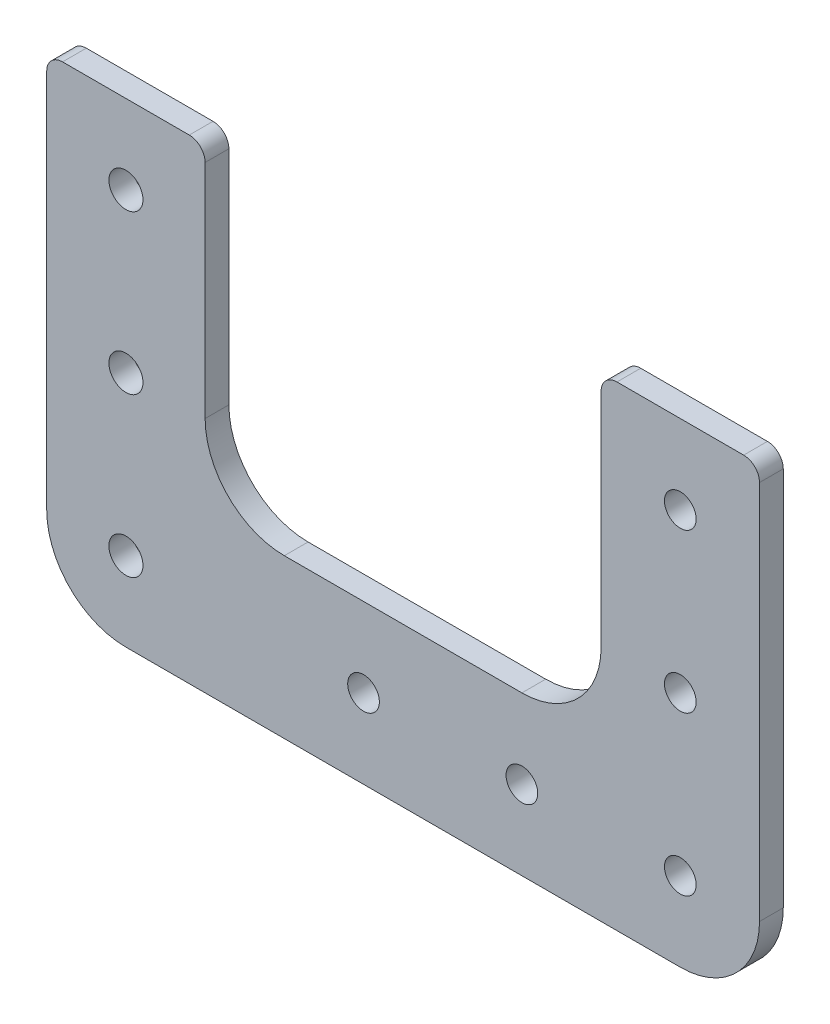
ISO-10303-21;
HEADER;
FILE_DESCRIPTION(('STEP AP214'),'2;1');
FILE_NAME('part.step','',(''),(''),'','','');
FILE_SCHEMA(('AUTOMOTIVE_DESIGN { 1 0 10303 214 1 1 1 1 }'));
ENDSEC;
DATA;
#1=APPLICATION_CONTEXT('core data for automotive mechanical design processes');
#2=APPLICATION_PROTOCOL_DEFINITION('international standard','automotive_design',2000,#1);
#3=PRODUCT_CONTEXT('',#1,'mechanical');
#4=PRODUCT('Part','Part','',(#3));
#5=PRODUCT_RELATED_PRODUCT_CATEGORY('part','',(#4));
#6=PRODUCT_DEFINITION_FORMATION('','',#4);
#7=PRODUCT_DEFINITION_CONTEXT('part definition',#1,'design');
#8=PRODUCT_DEFINITION('design','',#6,#7);
#9=PRODUCT_DEFINITION_SHAPE('','',#8);
#10=(LENGTH_UNIT() NAMED_UNIT(*) SI_UNIT(.MILLI.,.METRE.));
#11=(NAMED_UNIT(*) PLANE_ANGLE_UNIT() SI_UNIT($,.RADIAN.));
#12=(NAMED_UNIT(*) SI_UNIT($,.STERADIAN.) SOLID_ANGLE_UNIT());
#13=UNCERTAINTY_MEASURE_WITH_UNIT(LENGTH_MEASURE(1.E-05),#10,'distance_accuracy_value','');
#14=(GEOMETRIC_REPRESENTATION_CONTEXT(3) GLOBAL_UNCERTAINTY_ASSIGNED_CONTEXT((#13)) GLOBAL_UNIT_ASSIGNED_CONTEXT((#10,
#11,#12)) REPRESENTATION_CONTEXT('',''));
#15=CARTESIAN_POINT('',(0.,0.,0.));
#16=DIRECTION('',(0.,0.,1.));
#17=DIRECTION('',(1.,0.,0.));
#18=AXIS2_PLACEMENT_3D('',#15,#16,#17);
#19=CARTESIAN_POINT('',(0.,0.,3.));
#20=DIRECTION('',(1.,0.,0.));
#21=DIRECTION('',(0.,0.,-1.));
#22=AXIS2_PLACEMENT_3D('',#19,#20,#21);
#23=PLANE('',#22);
#24=DIRECTION('',(0.,-1.,0.));
#25=VECTOR('',#24,1.);
#26=CARTESIAN_POINT('',(0.,0.,3.));
#27=LINE('',#26,#25);
#28=CARTESIAN_POINT('',(0.,58.,3.));
#29=VERTEX_POINT('',#28);
#30=CARTESIAN_POINT('',(0.,30.,3.));
#31=VERTEX_POINT('',#30);
#32=EDGE_CURVE('E315',#29,#31,#27,.T.);
#33=ORIENTED_EDGE('',*,*,#32,.F.);
#34=DIRECTION('',(0.,0.,-1.));
#35=VECTOR('',#34,1.);
#36=CARTESIAN_POINT('',(0.,58.,3.));
#37=LINE('',#36,#35);
#38=CARTESIAN_POINT('',(0.,58.,0.));
#39=VERTEX_POINT('',#38);
#40=EDGE_CURVE('E243',#29,#39,#37,.T.);
#41=ORIENTED_EDGE('',*,*,#40,.T.);
#42=DIRECTION('',(0.,-1.,0.));
#43=VECTOR('',#42,1.);
#44=CARTESIAN_POINT('',(0.,0.,0.));
#45=LINE('',#44,#43);
#46=CARTESIAN_POINT('',(0.,30.,0.));
#47=VERTEX_POINT('',#46);
#48=EDGE_CURVE('E312',#39,#47,#45,.T.);
#49=ORIENTED_EDGE('',*,*,#48,.T.);
#50=DIRECTION('',(0.,0.,1.));
#51=VECTOR('',#50,1.);
#52=CARTESIAN_POINT('',(0.,30.,3.));
#53=LINE('',#52,#51);
#54=EDGE_CURVE('E168',#47,#31,#53,.T.);
#55=ORIENTED_EDGE('',*,*,#54,.T.);
#56=EDGE_LOOP('',(#33,#41,#49,#55));
#57=FACE_BOUND('',#56,.T.);
#58=ADVANCED_FACE('F43',(#57),#23,.F.);
#59=CARTESIAN_POINT('',(0.,0.,3.));
#60=DIRECTION('',(0.,1.,0.));
#61=DIRECTION('',(0.,0.,1.));
#62=AXIS2_PLACEMENT_3D('',#59,#60,#61);
#63=PLANE('',#62);
#64=DIRECTION('',(1.,0.,0.));
#65=VECTOR('',#64,1.);
#66=CARTESIAN_POINT('',(0.,0.,3.));
#67=LINE('',#66,#65);
#68=CARTESIAN_POINT('',(-60.,0.,3.));
#69=VERTEX_POINT('',#68);
#70=CARTESIAN_POINT('',(10.,0.,3.));
#71=VERTEX_POINT('',#70);
#72=EDGE_CURVE('E163',#69,#71,#67,.T.);
#73=ORIENTED_EDGE('',*,*,#72,.F.);
#74=DIRECTION('',(0.,0.,1.));
#75=VECTOR('',#74,1.);
#76=CARTESIAN_POINT('',(-60.,0.,0.));
#77=LINE('',#76,#75);
#78=CARTESIAN_POINT('',(-60.,0.,0.));
#79=VERTEX_POINT('',#78);
#80=EDGE_CURVE('E207',#69,#79,#77,.F.);
#81=ORIENTED_EDGE('',*,*,#80,.T.);
#82=DIRECTION('',(1.,0.,0.));
#83=VECTOR('',#82,1.);
#84=CARTESIAN_POINT('',(0.,0.,0.));
#85=LINE('',#84,#83);
#86=CARTESIAN_POINT('',(10.,0.,0.));
#87=VERTEX_POINT('',#86);
#88=EDGE_CURVE('E319',#79,#87,#85,.T.);
#89=ORIENTED_EDGE('',*,*,#88,.T.);
#90=DIRECTION('',(0.,0.,-1.));
#91=VECTOR('',#90,1.);
#92=CARTESIAN_POINT('',(10.,0.,3.));
#93=LINE('',#92,#91);
#94=EDGE_CURVE('E169',#87,#71,#93,.F.);
#95=ORIENTED_EDGE('',*,*,#94,.T.);
#96=EDGE_LOOP('',(#73,#81,#89,#95));
#97=FACE_BOUND('',#96,.T.);
#98=ADVANCED_FACE('F419',(#97),#63,.F.);
#99=CARTESIAN_POINT('',(20.,0.,3.));
#100=DIRECTION('',(-1.,0.,0.));
#101=DIRECTION('',(0.,-1.,0.));
#102=AXIS2_PLACEMENT_3D('',#99,#100,#101);
#103=PLANE('',#102);
#104=DIRECTION('',(0.,1.,0.));
#105=VECTOR('',#104,1.);
#106=CARTESIAN_POINT('',(20.,0.,0.));
#107=LINE('',#106,#105);
#108=CARTESIAN_POINT('',(20.,10.,0.));
#109=VERTEX_POINT('',#108);
#110=CARTESIAN_POINT('',(20.,58.,0.));
#111=VERTEX_POINT('',#110);
#112=EDGE_CURVE('E320',#109,#111,#107,.T.);
#113=ORIENTED_EDGE('',*,*,#112,.T.);
#114=DIRECTION('',(0.,0.,-1.));
#115=VECTOR('',#114,1.);
#116=CARTESIAN_POINT('',(20.,58.,3.));
#117=LINE('',#116,#115);
#118=CARTESIAN_POINT('',(20.,58.,3.));
#119=VERTEX_POINT('',#118);
#120=EDGE_CURVE('E178',#111,#119,#117,.F.);
#121=ORIENTED_EDGE('',*,*,#120,.T.);
#122=DIRECTION('',(0.,1.,0.));
#123=VECTOR('',#122,1.);
#124=CARTESIAN_POINT('',(20.,0.,3.));
#125=LINE('',#124,#123);
#126=CARTESIAN_POINT('',(20.,10.,3.));
#127=VERTEX_POINT('',#126);
#128=EDGE_CURVE('E160',#127,#119,#125,.T.);
#129=ORIENTED_EDGE('',*,*,#128,.F.);
#130=DIRECTION('',(0.,0.,-1.));
#131=VECTOR('',#130,1.);
#132=CARTESIAN_POINT('',(20.,10.,3.));
#133=LINE('',#132,#131);
#134=EDGE_CURVE('E175',#127,#109,#133,.T.);
#135=ORIENTED_EDGE('',*,*,#134,.T.);
#136=EDGE_LOOP('',(#113,#121,#129,#135));
#137=FACE_BOUND('',#136,.T.);
#138=ADVANCED_FACE('F174',(#137),#103,.F.);
#139=CARTESIAN_POINT('',(0.,60.,3.));
#140=DIRECTION('',(0.,-1.,0.));
#141=DIRECTION('',(0.,0.,-1.));
#142=AXIS2_PLACEMENT_3D('',#139,#140,#141);
#143=PLANE('',#142);
#144=DIRECTION('',(-1.,0.,0.));
#145=VECTOR('',#144,1.);
#146=CARTESIAN_POINT('',(0.,60.,3.));
#147=LINE('',#146,#145);
#148=CARTESIAN_POINT('',(18.,60.,3.));
#149=VERTEX_POINT('',#148);
#150=CARTESIAN_POINT('',(2.,60.,3.));
#151=VERTEX_POINT('',#150);
#152=EDGE_CURVE('E179',#149,#151,#147,.T.);
#153=ORIENTED_EDGE('',*,*,#152,.F.);
#154=DIRECTION('',(0.,0.,-1.));
#155=VECTOR('',#154,1.);
#156=CARTESIAN_POINT('',(18.,60.,3.));
#157=LINE('',#156,#155);
#158=CARTESIAN_POINT('',(18.,60.,0.));
#159=VERTEX_POINT('',#158);
#160=EDGE_CURVE('E225',#149,#159,#157,.T.);
#161=ORIENTED_EDGE('',*,*,#160,.T.);
#162=DIRECTION('',(-1.,0.,0.));
#163=VECTOR('',#162,1.);
#164=CARTESIAN_POINT('',(0.,60.,0.));
#165=LINE('',#164,#163);
#166=CARTESIAN_POINT('',(2.,60.,0.));
#167=VERTEX_POINT('',#166);
#168=EDGE_CURVE('E189',#159,#167,#165,.T.);
#169=ORIENTED_EDGE('',*,*,#168,.T.);
#170=DIRECTION('',(0.,0.,-1.));
#171=VECTOR('',#170,1.);
#172=CARTESIAN_POINT('',(2.,60.,3.));
#173=LINE('',#172,#171);
#174=EDGE_CURVE('E223',#167,#151,#173,.F.);
#175=ORIENTED_EDGE('',*,*,#174,.T.);
#176=EDGE_LOOP('',(#153,#161,#169,#175));
#177=FACE_BOUND('',#176,.T.);
#178=ADVANCED_FACE('F325',(#177),#143,.F.);
#179=CARTESIAN_POINT('',(0.,0.,3.));
#180=DIRECTION('',(0.,0.,-1.));
#181=DIRECTION('',(-1.,0.,0.));
#182=AXIS2_PLACEMENT_3D('',#179,#180,#181);
#183=PLANE('',#182);
#184=CARTESIAN_POINT('',(-60.,10.,3.));
#185=DIRECTION('',(0.,0.,1.));
#186=DIRECTION('',(1.,0.,0.));
#187=AXIS2_PLACEMENT_3D('',#184,#185,#186);
#188=CIRCLE('',#187,2.15);
#189=CARTESIAN_POINT('',(-57.85,10.,3.));
#190=VERTEX_POINT('',#189);
#191=EDGE_CURVE('E370',#190,#190,#188,.T.);
#192=ORIENTED_EDGE('',*,*,#191,.F.);
#193=EDGE_LOOP('',(#192));
#194=FACE_BOUND('',#193,.T.);
#195=CARTESIAN_POINT('',(-60.,30.,3.));
#196=DIRECTION('',(0.,0.,1.));
#197=DIRECTION('',(1.,0.,0.));
#198=AXIS2_PLACEMENT_3D('',#195,#196,#197);
#199=CIRCLE('',#198,2.15);
#200=CARTESIAN_POINT('',(-57.85,30.,3.));
#201=VERTEX_POINT('',#200);
#202=EDGE_CURVE('E367',#201,#201,#199,.T.);
#203=ORIENTED_EDGE('',*,*,#202,.F.);
#204=EDGE_LOOP('',(#203));
#205=FACE_BOUND('',#204,.T.);
#206=CARTESIAN_POINT('',(-60.,50.,3.));
#207=DIRECTION('',(0.,0.,1.));
#208=DIRECTION('',(1.,0.,0.));
#209=AXIS2_PLACEMENT_3D('',#206,#207,#208);
#210=CIRCLE('',#209,2.15);
#211=CARTESIAN_POINT('',(-57.85,50.,3.));
#212=VERTEX_POINT('',#211);
#213=EDGE_CURVE('E361',#212,#212,#210,.T.);
#214=ORIENTED_EDGE('',*,*,#213,.F.);
#215=EDGE_LOOP('',(#214));
#216=FACE_BOUND('',#215,.T.);
#217=CARTESIAN_POINT('',(-30.,10.,3.));
#218=DIRECTION('',(0.,0.,1.));
#219=DIRECTION('',(-1.,0.,0.));
#220=AXIS2_PLACEMENT_3D('',#217,#218,#219);
#221=CIRCLE('',#220,2.);
#222=CARTESIAN_POINT('',(-32.,10.,3.));
#223=VERTEX_POINT('',#222);
#224=EDGE_CURVE('E298',#223,#223,#221,.T.);
#225=ORIENTED_EDGE('',*,*,#224,.F.);
#226=EDGE_LOOP('',(#225));
#227=FACE_BOUND('',#226,.T.);
#228=CARTESIAN_POINT('',(-9.99999999999999,10.,3.));
#229=DIRECTION('',(0.,0.,1.));
#230=DIRECTION('',(-1.,0.,0.));
#231=AXIS2_PLACEMENT_3D('',#228,#229,#230);
#232=CIRCLE('',#231,2.);
#233=CARTESIAN_POINT('',(-12.,10.,3.));
#234=VERTEX_POINT('',#233);
#235=EDGE_CURVE('E292',#234,#234,#232,.T.);
#236=ORIENTED_EDGE('',*,*,#235,.F.);
#237=EDGE_LOOP('',(#236));
#238=FACE_BOUND('',#237,.T.);
#239=CARTESIAN_POINT('',(9.99999999999999,50.,3.));
#240=DIRECTION('',(0.,0.,1.));
#241=DIRECTION('',(1.,0.,0.));
#242=AXIS2_PLACEMENT_3D('',#239,#240,#241);
#243=CIRCLE('',#242,2.);
#244=CARTESIAN_POINT('',(12.,50.,3.));
#245=VERTEX_POINT('',#244);
#246=EDGE_CURVE('E286',#245,#245,#243,.T.);
#247=ORIENTED_EDGE('',*,*,#246,.F.);
#248=EDGE_LOOP('',(#247));
#249=FACE_BOUND('',#248,.T.);
#250=CARTESIAN_POINT('',(10.,30.,3.));
#251=DIRECTION('',(0.,0.,1.));
#252=DIRECTION('',(1.,0.,0.));
#253=AXIS2_PLACEMENT_3D('',#250,#251,#252);
#254=CIRCLE('',#253,2.);
#255=CARTESIAN_POINT('',(12.,30.,3.));
#256=VERTEX_POINT('',#255);
#257=EDGE_CURVE('E279',#256,#256,#254,.T.);
#258=ORIENTED_EDGE('',*,*,#257,.F.);
#259=EDGE_LOOP('',(#258));
#260=FACE_BOUND('',#259,.T.);
#261=CARTESIAN_POINT('',(10.,10.,3.));
#262=DIRECTION('',(0.,0.,1.));
#263=DIRECTION('',(1.,0.,0.));
#264=AXIS2_PLACEMENT_3D('',#261,#262,#263);
#265=CIRCLE('',#264,2.);
#266=CARTESIAN_POINT('',(12.,10.,3.));
#267=VERTEX_POINT('',#266);
#268=EDGE_CURVE('E282',#267,#267,#265,.T.);
#269=ORIENTED_EDGE('',*,*,#268,.F.);
#270=EDGE_LOOP('',(#269));
#271=FACE_BOUND('',#270,.T.);
#272=ORIENTED_EDGE('',*,*,#128,.T.);
#273=CARTESIAN_POINT('',(18.,58.,3.));
#274=DIRECTION('',(0.,0.,-1.));
#275=DIRECTION('',(-1.,0.,0.));
#276=AXIS2_PLACEMENT_3D('',#273,#274,#275);
#277=CIRCLE('',#276,2.);
#278=EDGE_CURVE('E241',#119,#149,#277,.F.);
#279=ORIENTED_EDGE('',*,*,#278,.T.);
#280=ORIENTED_EDGE('',*,*,#152,.T.);
#281=CARTESIAN_POINT('',(2.,58.,3.));
#282=DIRECTION('',(0.,0.,-1.));
#283=DIRECTION('',(-1.,0.,0.));
#284=AXIS2_PLACEMENT_3D('',#281,#282,#283);
#285=CIRCLE('',#284,2.);
#286=EDGE_CURVE('E239',#151,#29,#285,.F.);
#287=ORIENTED_EDGE('',*,*,#286,.T.);
#288=ORIENTED_EDGE('',*,*,#32,.T.);
#289=CARTESIAN_POINT('',(-10.,30.,3.));
#290=DIRECTION('',(0.,0.,-1.));
#291=DIRECTION('',(-1.,0.,0.));
#292=AXIS2_PLACEMENT_3D('',#289,#290,#291);
#293=CIRCLE('',#292,10.);
#294=CARTESIAN_POINT('',(-10.,20.,3.));
#295=VERTEX_POINT('',#294);
#296=EDGE_CURVE('E197',#31,#295,#293,.T.);
#297=ORIENTED_EDGE('',*,*,#296,.T.);
#298=DIRECTION('',(-1.,0.,0.));
#299=VECTOR('',#298,1.);
#300=CARTESIAN_POINT('',(20.,20.,3.));
#301=LINE('',#300,#299);
#302=CARTESIAN_POINT('',(-40.,20.,3.));
#303=VERTEX_POINT('',#302);
#304=EDGE_CURVE('E306',#295,#303,#301,.T.);
#305=ORIENTED_EDGE('',*,*,#304,.T.);
#306=CARTESIAN_POINT('',(-40.,30.,3.));
#307=DIRECTION('',(0.,0.,-1.));
#308=DIRECTION('',(-1.,0.,0.));
#309=AXIS2_PLACEMENT_3D('',#306,#307,#308);
#310=CIRCLE('',#309,10.);
#311=CARTESIAN_POINT('',(-50.,30.,3.));
#312=VERTEX_POINT('',#311);
#313=EDGE_CURVE('E218',#303,#312,#310,.T.);
#314=ORIENTED_EDGE('',*,*,#313,.T.);
#315=DIRECTION('',(0.,-1.,0.));
#316=VECTOR('',#315,1.);
#317=CARTESIAN_POINT('',(-50.,0.,3.));
#318=LINE('',#317,#316);
#319=CARTESIAN_POINT('',(-50.,58.,3.));
#320=VERTEX_POINT('',#319);
#321=EDGE_CURVE('E272',#320,#312,#318,.T.);
#322=ORIENTED_EDGE('',*,*,#321,.F.);
#323=CARTESIAN_POINT('',(-52.,58.,3.));
#324=DIRECTION('',(0.,0.,-1.));
#325=DIRECTION('',(-1.,0.,0.));
#326=AXIS2_PLACEMENT_3D('',#323,#324,#325);
#327=CIRCLE('',#326,2.);
#328=CARTESIAN_POINT('',(-52.,60.,3.));
#329=VERTEX_POINT('',#328);
#330=EDGE_CURVE('E58',#320,#329,#327,.F.);
#331=ORIENTED_EDGE('',*,*,#330,.T.);
#332=DIRECTION('',(1.,0.,0.));
#333=VECTOR('',#332,1.);
#334=CARTESIAN_POINT('',(0.,60.,3.));
#335=LINE('',#334,#333);
#336=CARTESIAN_POINT('',(-68.,60.,3.));
#337=VERTEX_POINT('',#336);
#338=EDGE_CURVE('E270',#337,#329,#335,.T.);
#339=ORIENTED_EDGE('',*,*,#338,.F.);
#340=CARTESIAN_POINT('',(-68.,58.,3.));
#341=DIRECTION('',(0.,0.,-1.));
#342=DIRECTION('',(-1.,0.,0.));
#343=AXIS2_PLACEMENT_3D('',#340,#341,#342);
#344=CIRCLE('',#343,2.);
#345=CARTESIAN_POINT('',(-70.,58.,3.));
#346=VERTEX_POINT('',#345);
#347=EDGE_CURVE('E66',#337,#346,#344,.F.);
#348=ORIENTED_EDGE('',*,*,#347,.T.);
#349=DIRECTION('',(0.,-1.,0.));
#350=VECTOR('',#349,1.);
#351=CARTESIAN_POINT('',(-70.,0.,3.));
#352=LINE('',#351,#350);
#353=CARTESIAN_POINT('',(-70.,10.,3.));
#354=VERTEX_POINT('',#353);
#355=EDGE_CURVE('E254',#346,#354,#352,.T.);
#356=ORIENTED_EDGE('',*,*,#355,.T.);
#357=CARTESIAN_POINT('',(-60.,10.,3.));
#358=DIRECTION('',(0.,0.,-1.));
#359=DIRECTION('',(-1.,0.,0.));
#360=AXIS2_PLACEMENT_3D('',#357,#358,#359);
#361=CIRCLE('',#360,10.);
#362=EDGE_CURVE('E205',#354,#69,#361,.F.);
#363=ORIENTED_EDGE('',*,*,#362,.T.);
#364=ORIENTED_EDGE('',*,*,#72,.T.);
#365=CARTESIAN_POINT('',(10.,10.,3.));
#366=DIRECTION('',(0.,0.,-1.));
#367=DIRECTION('',(-1.,0.,0.));
#368=AXIS2_PLACEMENT_3D('',#365,#366,#367);
#369=CIRCLE('',#368,10.);
#370=EDGE_CURVE('E157',#71,#127,#369,.F.);
#371=ORIENTED_EDGE('',*,*,#370,.T.);
#372=EDGE_LOOP('',(#272,#279,#280,#287,#288,#297,#305,#314,#322,#331,#339,#348,#356,#363,#364,#371));
#373=FACE_BOUND('',#372,.T.);
#374=ADVANCED_FACE('F159',(#194,#205,#216,#227,#238,#249,#260,#271,#373),#183,.F.);
#375=CARTESIAN_POINT('',(0.,0.,0.));
#376=DIRECTION('',(0.,0.,-1.));
#377=DIRECTION('',(-1.,0.,0.));
#378=AXIS2_PLACEMENT_3D('',#375,#376,#377);
#379=PLANE('',#378);
#380=CARTESIAN_POINT('',(-60.,10.,0.));
#381=DIRECTION('',(0.,0.,1.));
#382=DIRECTION('',(1.,0.,0.));
#383=AXIS2_PLACEMENT_3D('',#380,#381,#382);
#384=CIRCLE('',#383,2.15);
#385=CARTESIAN_POINT('',(-57.85,10.,0.));
#386=VERTEX_POINT('',#385);
#387=EDGE_CURVE('E276',#386,#386,#384,.T.);
#388=ORIENTED_EDGE('',*,*,#387,.T.);
#389=EDGE_LOOP('',(#388));
#390=FACE_BOUND('',#389,.T.);
#391=CARTESIAN_POINT('',(-60.,30.,0.));
#392=DIRECTION('',(0.,0.,1.));
#393=DIRECTION('',(1.,0.,0.));
#394=AXIS2_PLACEMENT_3D('',#391,#392,#393);
#395=CIRCLE('',#394,2.15);
#396=CARTESIAN_POINT('',(-57.85,30.,0.));
#397=VERTEX_POINT('',#396);
#398=EDGE_CURVE('E364',#397,#397,#395,.T.);
#399=ORIENTED_EDGE('',*,*,#398,.T.);
#400=EDGE_LOOP('',(#399));
#401=FACE_BOUND('',#400,.T.);
#402=CARTESIAN_POINT('',(-60.,50.,0.));
#403=DIRECTION('',(0.,0.,1.));
#404=DIRECTION('',(1.,0.,0.));
#405=AXIS2_PLACEMENT_3D('',#402,#403,#404);
#406=CIRCLE('',#405,2.15);
#407=CARTESIAN_POINT('',(-57.85,50.,0.));
#408=VERTEX_POINT('',#407);
#409=EDGE_CURVE('E358',#408,#408,#406,.T.);
#410=ORIENTED_EDGE('',*,*,#409,.T.);
#411=EDGE_LOOP('',(#410));
#412=FACE_BOUND('',#411,.T.);
#413=CARTESIAN_POINT('',(-30.,10.,0.));
#414=DIRECTION('',(0.,0.,1.));
#415=DIRECTION('',(-1.,0.,0.));
#416=AXIS2_PLACEMENT_3D('',#413,#414,#415);
#417=CIRCLE('',#416,2.);
#418=CARTESIAN_POINT('',(-32.,10.,0.));
#419=VERTEX_POINT('',#418);
#420=EDGE_CURVE('E264',#419,#419,#417,.T.);
#421=ORIENTED_EDGE('',*,*,#420,.T.);
#422=EDGE_LOOP('',(#421));
#423=FACE_BOUND('',#422,.T.);
#424=CARTESIAN_POINT('',(-9.99999999999999,10.,0.));
#425=DIRECTION('',(0.,0.,1.));
#426=DIRECTION('',(-1.,0.,0.));
#427=AXIS2_PLACEMENT_3D('',#424,#425,#426);
#428=CIRCLE('',#427,2.);
#429=CARTESIAN_POINT('',(-12.,10.,0.));
#430=VERTEX_POINT('',#429);
#431=EDGE_CURVE('E295',#430,#430,#428,.T.);
#432=ORIENTED_EDGE('',*,*,#431,.T.);
#433=EDGE_LOOP('',(#432));
#434=FACE_BOUND('',#433,.T.);
#435=CARTESIAN_POINT('',(9.99999999999999,50.,0.));
#436=DIRECTION('',(0.,0.,1.));
#437=DIRECTION('',(1.,0.,0.));
#438=AXIS2_PLACEMENT_3D('',#435,#436,#437);
#439=CIRCLE('',#438,2.);
#440=CARTESIAN_POINT('',(12.,50.,0.));
#441=VERTEX_POINT('',#440);
#442=EDGE_CURVE('E289',#441,#441,#439,.T.);
#443=ORIENTED_EDGE('',*,*,#442,.T.);
#444=EDGE_LOOP('',(#443));
#445=FACE_BOUND('',#444,.T.);
#446=CARTESIAN_POINT('',(10.,30.,0.));
#447=DIRECTION('',(0.,0.,1.));
#448=DIRECTION('',(1.,0.,0.));
#449=AXIS2_PLACEMENT_3D('',#446,#447,#448);
#450=CIRCLE('',#449,2.);
#451=CARTESIAN_POINT('',(12.,30.,0.));
#452=VERTEX_POINT('',#451);
#453=EDGE_CURVE('E283',#452,#452,#450,.T.);
#454=ORIENTED_EDGE('',*,*,#453,.T.);
#455=EDGE_LOOP('',(#454));
#456=FACE_BOUND('',#455,.T.);
#457=CARTESIAN_POINT('',(10.,10.,0.));
#458=DIRECTION('',(0.,0.,1.));
#459=DIRECTION('',(1.,0.,0.));
#460=AXIS2_PLACEMENT_3D('',#457,#458,#459);
#461=CIRCLE('',#460,2.);
#462=CARTESIAN_POINT('',(12.,10.,0.));
#463=VERTEX_POINT('',#462);
#464=EDGE_CURVE('E303',#463,#463,#461,.T.);
#465=ORIENTED_EDGE('',*,*,#464,.T.);
#466=EDGE_LOOP('',(#465));
#467=FACE_BOUND('',#466,.T.);
#468=ORIENTED_EDGE('',*,*,#168,.F.);
#469=CARTESIAN_POINT('',(18.,58.,0.));
#470=DIRECTION('',(0.,0.,-1.));
#471=DIRECTION('',(-1.,0.,0.));
#472=AXIS2_PLACEMENT_3D('',#469,#470,#471);
#473=CIRCLE('',#472,2.);
#474=EDGE_CURVE('E234',#159,#111,#473,.T.);
#475=ORIENTED_EDGE('',*,*,#474,.T.);
#476=ORIENTED_EDGE('',*,*,#112,.F.);
#477=CARTESIAN_POINT('',(10.,10.,0.));
#478=DIRECTION('',(0.,0.,-1.));
#479=DIRECTION('',(-1.,0.,0.));
#480=AXIS2_PLACEMENT_3D('',#477,#478,#479);
#481=CIRCLE('',#480,10.);
#482=EDGE_CURVE('E183',#109,#87,#481,.T.);
#483=ORIENTED_EDGE('',*,*,#482,.T.);
#484=ORIENTED_EDGE('',*,*,#88,.F.);
#485=CARTESIAN_POINT('',(-60.,10.,0.));
#486=DIRECTION('',(0.,0.,-1.));
#487=DIRECTION('',(-1.,0.,0.));
#488=AXIS2_PLACEMENT_3D('',#485,#486,#487);
#489=CIRCLE('',#488,10.);
#490=CARTESIAN_POINT('',(-70.,10.,0.));
#491=VERTEX_POINT('',#490);
#492=EDGE_CURVE('E209',#79,#491,#489,.T.);
#493=ORIENTED_EDGE('',*,*,#492,.T.);
#494=DIRECTION('',(0.,-1.,0.));
#495=VECTOR('',#494,1.);
#496=CARTESIAN_POINT('',(-70.,0.,0.));
#497=LINE('',#496,#495);
#498=CARTESIAN_POINT('',(-70.,58.,0.));
#499=VERTEX_POINT('',#498);
#500=EDGE_CURVE('E253',#499,#491,#497,.T.);
#501=ORIENTED_EDGE('',*,*,#500,.F.);
#502=CARTESIAN_POINT('',(-68.,58.,0.));
#503=DIRECTION('',(0.,0.,-1.));
#504=DIRECTION('',(-1.,0.,0.));
#505=AXIS2_PLACEMENT_3D('',#502,#503,#504);
#506=CIRCLE('',#505,2.);
#507=CARTESIAN_POINT('',(-68.,60.,0.));
#508=VERTEX_POINT('',#507);
#509=EDGE_CURVE('E230',#499,#508,#506,.T.);
#510=ORIENTED_EDGE('',*,*,#509,.T.);
#511=DIRECTION('',(1.,0.,0.));
#512=VECTOR('',#511,1.);
#513=CARTESIAN_POINT('',(0.,60.,0.));
#514=LINE('',#513,#512);
#515=CARTESIAN_POINT('',(-52.,60.,0.));
#516=VERTEX_POINT('',#515);
#517=EDGE_CURVE('E265',#508,#516,#514,.T.);
#518=ORIENTED_EDGE('',*,*,#517,.T.);
#519=CARTESIAN_POINT('',(-52.,58.,0.));
#520=DIRECTION('',(0.,0.,-1.));
#521=DIRECTION('',(-1.,0.,0.));
#522=AXIS2_PLACEMENT_3D('',#519,#520,#521);
#523=CIRCLE('',#522,2.);
#524=CARTESIAN_POINT('',(-50.,58.,0.));
#525=VERTEX_POINT('',#524);
#526=EDGE_CURVE('E228',#516,#525,#523,.T.);
#527=ORIENTED_EDGE('',*,*,#526,.T.);
#528=DIRECTION('',(0.,-1.,0.));
#529=VECTOR('',#528,1.);
#530=CARTESIAN_POINT('',(-50.,0.,0.));
#531=LINE('',#530,#529);
#532=CARTESIAN_POINT('',(-50.,30.,0.));
#533=VERTEX_POINT('',#532);
#534=EDGE_CURVE('E274',#525,#533,#531,.T.);
#535=ORIENTED_EDGE('',*,*,#534,.T.);
#536=CARTESIAN_POINT('',(-40.,30.,0.));
#537=DIRECTION('',(0.,0.,-1.));
#538=DIRECTION('',(-1.,0.,0.));
#539=AXIS2_PLACEMENT_3D('',#536,#537,#538);
#540=CIRCLE('',#539,10.);
#541=CARTESIAN_POINT('',(-40.,20.,0.));
#542=VERTEX_POINT('',#541);
#543=EDGE_CURVE('E221',#533,#542,#540,.F.);
#544=ORIENTED_EDGE('',*,*,#543,.T.);
#545=DIRECTION('',(-1.,0.,0.));
#546=VECTOR('',#545,1.);
#547=CARTESIAN_POINT('',(20.,20.,0.));
#548=LINE('',#547,#546);
#549=CARTESIAN_POINT('',(-10.,20.,0.));
#550=VERTEX_POINT('',#549);
#551=EDGE_CURVE('E309',#550,#542,#548,.T.);
#552=ORIENTED_EDGE('',*,*,#551,.F.);
#553=CARTESIAN_POINT('',(-10.,30.,0.));
#554=DIRECTION('',(0.,0.,-1.));
#555=DIRECTION('',(-1.,0.,0.));
#556=AXIS2_PLACEMENT_3D('',#553,#554,#555);
#557=CIRCLE('',#556,10.);
#558=EDGE_CURVE('E199',#550,#47,#557,.F.);
#559=ORIENTED_EDGE('',*,*,#558,.T.);
#560=ORIENTED_EDGE('',*,*,#48,.F.);
#561=CARTESIAN_POINT('',(2.,58.,0.));
#562=DIRECTION('',(0.,0.,-1.));
#563=DIRECTION('',(-1.,0.,0.));
#564=AXIS2_PLACEMENT_3D('',#561,#562,#563);
#565=CIRCLE('',#564,2.);
#566=EDGE_CURVE('E232',#39,#167,#565,.T.);
#567=ORIENTED_EDGE('',*,*,#566,.T.);
#568=EDGE_LOOP('',(#468,#475,#476,#483,#484,#493,#501,#510,#518,#527,#535,#544,#552,#559,#560,#567));
#569=FACE_BOUND('',#568,.T.);
#570=ADVANCED_FACE('F258',(#390,#401,#412,#423,#434,#445,#456,#467,#569),#379,.T.);
#571=CARTESIAN_POINT('',(20.,20.,0.));
#572=DIRECTION('',(0.,1.,0.));
#573=DIRECTION('',(-1.,0.,0.));
#574=AXIS2_PLACEMENT_3D('',#571,#572,#573);
#575=PLANE('',#574);
#576=ORIENTED_EDGE('',*,*,#551,.T.);
#577=DIRECTION('',(0.,0.,1.));
#578=VECTOR('',#577,1.);
#579=CARTESIAN_POINT('',(-40.,20.,0.));
#580=LINE('',#579,#578);
#581=EDGE_CURVE('E212',#542,#303,#580,.T.);
#582=ORIENTED_EDGE('',*,*,#581,.T.);
#583=ORIENTED_EDGE('',*,*,#304,.F.);
#584=DIRECTION('',(0.,0.,1.));
#585=VECTOR('',#584,1.);
#586=CARTESIAN_POINT('',(-10.,20.,0.));
#587=LINE('',#586,#585);
#588=EDGE_CURVE('E195',#295,#550,#587,.F.);
#589=ORIENTED_EDGE('',*,*,#588,.T.);
#590=EDGE_LOOP('',(#576,#582,#583,#589));
#591=FACE_BOUND('',#590,.T.);
#592=ADVANCED_FACE('F342',(#591),#575,.T.);
#593=CARTESIAN_POINT('',(10.,10.,0.));
#594=DIRECTION('',(0.,0.,1.));
#595=DIRECTION('',(1.,0.,0.));
#596=AXIS2_PLACEMENT_3D('',#593,#594,#595);
#597=CYLINDRICAL_SURFACE('',#596,2.);
#598=ORIENTED_EDGE('',*,*,#464,.F.);
#599=EDGE_LOOP('',(#598));
#600=FACE_BOUND('',#599,.T.);
#601=ORIENTED_EDGE('',*,*,#268,.T.);
#602=EDGE_LOOP('',(#601));
#603=FACE_BOUND('',#602,.T.);
#604=ADVANCED_FACE('F403',(#600,#603),#597,.F.);
#605=CARTESIAN_POINT('',(10.,30.,0.));
#606=DIRECTION('',(0.,0.,1.));
#607=DIRECTION('',(1.,0.,0.));
#608=AXIS2_PLACEMENT_3D('',#605,#606,#607);
#609=CYLINDRICAL_SURFACE('',#608,2.);
#610=ORIENTED_EDGE('',*,*,#453,.F.);
#611=EDGE_LOOP('',(#610));
#612=FACE_BOUND('',#611,.T.);
#613=ORIENTED_EDGE('',*,*,#257,.T.);
#614=EDGE_LOOP('',(#613));
#615=FACE_BOUND('',#614,.T.);
#616=ADVANCED_FACE('F405',(#612,#615),#609,.F.);
#617=CARTESIAN_POINT('',(9.99999999999999,50.,0.));
#618=DIRECTION('',(0.,0.,1.));
#619=DIRECTION('',(1.,0.,0.));
#620=AXIS2_PLACEMENT_3D('',#617,#618,#619);
#621=CYLINDRICAL_SURFACE('',#620,2.);
#622=ORIENTED_EDGE('',*,*,#442,.F.);
#623=EDGE_LOOP('',(#622));
#624=FACE_BOUND('',#623,.T.);
#625=ORIENTED_EDGE('',*,*,#246,.T.);
#626=EDGE_LOOP('',(#625));
#627=FACE_BOUND('',#626,.T.);
#628=ADVANCED_FACE('F411',(#624,#627),#621,.F.);
#629=CARTESIAN_POINT('',(-9.99999999999999,10.,0.));
#630=DIRECTION('',(0.,0.,1.));
#631=DIRECTION('',(1.,0.,0.));
#632=AXIS2_PLACEMENT_3D('',#629,#630,#631);
#633=CYLINDRICAL_SURFACE('',#632,2.);
#634=ORIENTED_EDGE('',*,*,#431,.F.);
#635=EDGE_LOOP('',(#634));
#636=FACE_BOUND('',#635,.T.);
#637=ORIENTED_EDGE('',*,*,#235,.T.);
#638=EDGE_LOOP('',(#637));
#639=FACE_BOUND('',#638,.T.);
#640=ADVANCED_FACE('F617',(#636,#639),#633,.F.);
#641=CARTESIAN_POINT('',(-30.,10.,0.));
#642=DIRECTION('',(0.,0.,1.));
#643=DIRECTION('',(1.,0.,0.));
#644=AXIS2_PLACEMENT_3D('',#641,#642,#643);
#645=CYLINDRICAL_SURFACE('',#644,2.);
#646=ORIENTED_EDGE('',*,*,#420,.F.);
#647=EDGE_LOOP('',(#646));
#648=FACE_BOUND('',#647,.T.);
#649=ORIENTED_EDGE('',*,*,#224,.T.);
#650=EDGE_LOOP('',(#649));
#651=FACE_BOUND('',#650,.T.);
#652=ADVANCED_FACE('F432',(#648,#651),#645,.F.);
#653=CARTESIAN_POINT('',(10.,10.,3.));
#654=DIRECTION('',(0.,0.,-1.));
#655=DIRECTION('',(-1.,0.,0.));
#656=AXIS2_PLACEMENT_3D('',#653,#654,#655);
#657=CYLINDRICAL_SURFACE('',#656,10.);
#658=ORIENTED_EDGE('',*,*,#370,.F.);
#659=ORIENTED_EDGE('',*,*,#94,.F.);
#660=ORIENTED_EDGE('',*,*,#482,.F.);
#661=ORIENTED_EDGE('',*,*,#134,.F.);
#662=EDGE_LOOP('',(#658,#659,#660,#661));
#663=FACE_BOUND('',#662,.T.);
#664=ADVANCED_FACE('F181',(#663),#657,.T.);
#665=CARTESIAN_POINT('',(-10.,30.,3.));
#666=DIRECTION('',(0.,0.,1.));
#667=DIRECTION('',(1.,0.,0.));
#668=AXIS2_PLACEMENT_3D('',#665,#666,#667);
#669=CYLINDRICAL_SURFACE('',#668,10.);
#670=ORIENTED_EDGE('',*,*,#558,.F.);
#671=ORIENTED_EDGE('',*,*,#588,.F.);
#672=ORIENTED_EDGE('',*,*,#296,.F.);
#673=ORIENTED_EDGE('',*,*,#54,.F.);
#674=EDGE_LOOP('',(#670,#671,#672,#673));
#675=FACE_BOUND('',#674,.T.);
#676=ADVANCED_FACE('F338',(#675),#669,.F.);
#677=CARTESIAN_POINT('',(-50.,0.,0.));
#678=DIRECTION('',(-1.,0.,0.));
#679=DIRECTION('',(0.,-1.,0.));
#680=AXIS2_PLACEMENT_3D('',#677,#678,#679);
#681=PLANE('',#680);
#682=ORIENTED_EDGE('',*,*,#534,.F.);
#683=DIRECTION('',(0.,0.,1.));
#684=VECTOR('',#683,1.);
#685=CARTESIAN_POINT('',(-50.,58.,0.));
#686=LINE('',#685,#684);
#687=EDGE_CURVE('E11',#525,#320,#686,.T.);
#688=ORIENTED_EDGE('',*,*,#687,.T.);
#689=ORIENTED_EDGE('',*,*,#321,.T.);
#690=DIRECTION('',(0.,0.,1.));
#691=VECTOR('',#690,1.);
#692=CARTESIAN_POINT('',(-50.,30.,0.));
#693=LINE('',#692,#691);
#694=EDGE_CURVE('E215',#312,#533,#693,.F.);
#695=ORIENTED_EDGE('',*,*,#694,.T.);
#696=EDGE_LOOP('',(#682,#688,#689,#695));
#697=FACE_BOUND('',#696,.T.);
#698=ADVANCED_FACE('F351',(#697),#681,.F.);
#699=CARTESIAN_POINT('',(-70.,0.,0.));
#700=DIRECTION('',(-1.,0.,0.));
#701=DIRECTION('',(0.,-1.,0.));
#702=AXIS2_PLACEMENT_3D('',#699,#700,#701);
#703=PLANE('',#702);
#704=ORIENTED_EDGE('',*,*,#355,.F.);
#705=DIRECTION('',(0.,0.,1.));
#706=VECTOR('',#705,1.);
#707=CARTESIAN_POINT('',(-70.,58.,0.));
#708=LINE('',#707,#706);
#709=EDGE_CURVE('E51',#346,#499,#708,.F.);
#710=ORIENTED_EDGE('',*,*,#709,.T.);
#711=ORIENTED_EDGE('',*,*,#500,.T.);
#712=DIRECTION('',(0.,0.,1.));
#713=VECTOR('',#712,1.);
#714=CARTESIAN_POINT('',(-70.,10.,3.));
#715=LINE('',#714,#713);
#716=EDGE_CURVE('E202',#491,#354,#715,.T.);
#717=ORIENTED_EDGE('',*,*,#716,.T.);
#718=EDGE_LOOP('',(#704,#710,#711,#717));
#719=FACE_BOUND('',#718,.T.);
#720=ADVANCED_FACE('F252',(#719),#703,.T.);
#721=CARTESIAN_POINT('',(0.,60.,0.));
#722=DIRECTION('',(0.,-1.,0.));
#723=DIRECTION('',(1.,0.,0.));
#724=AXIS2_PLACEMENT_3D('',#721,#722,#723);
#725=PLANE('',#724);
#726=ORIENTED_EDGE('',*,*,#517,.F.);
#727=DIRECTION('',(0.,0.,1.));
#728=VECTOR('',#727,1.);
#729=CARTESIAN_POINT('',(-68.,60.,3.));
#730=LINE('',#729,#728);
#731=EDGE_CURVE('E248',#508,#337,#730,.T.);
#732=ORIENTED_EDGE('',*,*,#731,.T.);
#733=ORIENTED_EDGE('',*,*,#338,.T.);
#734=DIRECTION('',(0.,0.,1.));
#735=VECTOR('',#734,1.);
#736=CARTESIAN_POINT('',(-52.,60.,0.));
#737=LINE('',#736,#735);
#738=EDGE_CURVE('E246',#329,#516,#737,.F.);
#739=ORIENTED_EDGE('',*,*,#738,.T.);
#740=EDGE_LOOP('',(#726,#732,#733,#739));
#741=FACE_BOUND('',#740,.T.);
#742=ADVANCED_FACE('F269',(#741),#725,.F.);
#743=CARTESIAN_POINT('',(-60.,50.,0.));
#744=DIRECTION('',(0.,0.,1.));
#745=DIRECTION('',(1.,0.,0.));
#746=AXIS2_PLACEMENT_3D('',#743,#744,#745);
#747=CYLINDRICAL_SURFACE('',#746,2.15);
#748=ORIENTED_EDGE('',*,*,#409,.F.);
#749=EDGE_LOOP('',(#748));
#750=FACE_BOUND('',#749,.T.);
#751=ORIENTED_EDGE('',*,*,#213,.T.);
#752=EDGE_LOOP('',(#751));
#753=FACE_BOUND('',#752,.T.);
#754=ADVANCED_FACE('F495',(#750,#753),#747,.F.);
#755=CARTESIAN_POINT('',(-60.,30.,0.));
#756=DIRECTION('',(0.,0.,1.));
#757=DIRECTION('',(1.,0.,0.));
#758=AXIS2_PLACEMENT_3D('',#755,#756,#757);
#759=CYLINDRICAL_SURFACE('',#758,2.15);
#760=ORIENTED_EDGE('',*,*,#398,.F.);
#761=EDGE_LOOP('',(#760));
#762=FACE_BOUND('',#761,.T.);
#763=ORIENTED_EDGE('',*,*,#202,.T.);
#764=EDGE_LOOP('',(#763));
#765=FACE_BOUND('',#764,.T.);
#766=ADVANCED_FACE('F382',(#762,#765),#759,.F.);
#767=CARTESIAN_POINT('',(-60.,10.,0.));
#768=DIRECTION('',(0.,0.,1.));
#769=DIRECTION('',(1.,0.,0.));
#770=AXIS2_PLACEMENT_3D('',#767,#768,#769);
#771=CYLINDRICAL_SURFACE('',#770,2.15);
#772=ORIENTED_EDGE('',*,*,#387,.F.);
#773=EDGE_LOOP('',(#772));
#774=FACE_BOUND('',#773,.T.);
#775=ORIENTED_EDGE('',*,*,#191,.T.);
#776=EDGE_LOOP('',(#775));
#777=FACE_BOUND('',#776,.T.);
#778=ADVANCED_FACE('F378',(#774,#777),#771,.F.);
#779=CARTESIAN_POINT('',(-60.,10.,0.));
#780=DIRECTION('',(0.,0.,-1.));
#781=DIRECTION('',(-1.,0.,0.));
#782=AXIS2_PLACEMENT_3D('',#779,#780,#781);
#783=CYLINDRICAL_SURFACE('',#782,10.);
#784=ORIENTED_EDGE('',*,*,#492,.F.);
#785=ORIENTED_EDGE('',*,*,#80,.F.);
#786=ORIENTED_EDGE('',*,*,#362,.F.);
#787=ORIENTED_EDGE('',*,*,#716,.F.);
#788=EDGE_LOOP('',(#784,#785,#786,#787));
#789=FACE_BOUND('',#788,.T.);
#790=ADVANCED_FACE('F381',(#789),#783,.T.);
#791=CARTESIAN_POINT('',(-40.,30.,0.));
#792=DIRECTION('',(0.,0.,1.));
#793=DIRECTION('',(1.,0.,0.));
#794=AXIS2_PLACEMENT_3D('',#791,#792,#793);
#795=CYLINDRICAL_SURFACE('',#794,10.);
#796=ORIENTED_EDGE('',*,*,#543,.F.);
#797=ORIENTED_EDGE('',*,*,#694,.F.);
#798=ORIENTED_EDGE('',*,*,#313,.F.);
#799=ORIENTED_EDGE('',*,*,#581,.F.);
#800=EDGE_LOOP('',(#796,#797,#798,#799));
#801=FACE_BOUND('',#800,.T.);
#802=ADVANCED_FACE('F347',(#801),#795,.F.);
#803=CARTESIAN_POINT('',(18.,58.,3.));
#804=DIRECTION('',(0.,0.,-1.));
#805=DIRECTION('',(-1.,0.,0.));
#806=AXIS2_PLACEMENT_3D('',#803,#804,#805);
#807=CYLINDRICAL_SURFACE('',#806,2.);
#808=ORIENTED_EDGE('',*,*,#278,.F.);
#809=ORIENTED_EDGE('',*,*,#120,.F.);
#810=ORIENTED_EDGE('',*,*,#474,.F.);
#811=ORIENTED_EDGE('',*,*,#160,.F.);
#812=EDGE_LOOP('',(#808,#809,#810,#811));
#813=FACE_BOUND('',#812,.T.);
#814=ADVANCED_FACE('F439',(#813),#807,.T.);
#815=CARTESIAN_POINT('',(2.,58.,3.));
#816=DIRECTION('',(0.,0.,-1.));
#817=DIRECTION('',(-1.,0.,0.));
#818=AXIS2_PLACEMENT_3D('',#815,#816,#817);
#819=CYLINDRICAL_SURFACE('',#818,2.);
#820=ORIENTED_EDGE('',*,*,#286,.F.);
#821=ORIENTED_EDGE('',*,*,#174,.F.);
#822=ORIENTED_EDGE('',*,*,#566,.F.);
#823=ORIENTED_EDGE('',*,*,#40,.F.);
#824=EDGE_LOOP('',(#820,#821,#822,#823));
#825=FACE_BOUND('',#824,.T.);
#826=ADVANCED_FACE('F329',(#825),#819,.T.);
#827=CARTESIAN_POINT('',(-68.,58.,0.));
#828=DIRECTION('',(0.,0.,-1.));
#829=DIRECTION('',(-1.,0.,0.));
#830=AXIS2_PLACEMENT_3D('',#827,#828,#829);
#831=CYLINDRICAL_SURFACE('',#830,2.);
#832=ORIENTED_EDGE('',*,*,#509,.F.);
#833=ORIENTED_EDGE('',*,*,#709,.F.);
#834=ORIENTED_EDGE('',*,*,#347,.F.);
#835=ORIENTED_EDGE('',*,*,#731,.F.);
#836=EDGE_LOOP('',(#832,#833,#834,#835));
#837=FACE_BOUND('',#836,.T.);
#838=ADVANCED_FACE('F267',(#837),#831,.T.);
#839=CARTESIAN_POINT('',(-52.,58.,0.));
#840=DIRECTION('',(0.,0.,1.));
#841=DIRECTION('',(1.,0.,0.));
#842=AXIS2_PLACEMENT_3D('',#839,#840,#841);
#843=CYLINDRICAL_SURFACE('',#842,2.);
#844=ORIENTED_EDGE('',*,*,#526,.F.);
#845=ORIENTED_EDGE('',*,*,#738,.F.);
#846=ORIENTED_EDGE('',*,*,#330,.F.);
#847=ORIENTED_EDGE('',*,*,#687,.F.);
#848=EDGE_LOOP('',(#844,#845,#846,#847));
#849=FACE_BOUND('',#848,.T.);
#850=ADVANCED_FACE('F45',(#849),#843,.T.);
#851=CLOSED_SHELL('',(#58,#98,#138,#178,#374,#570,#592,#604,#616,#628,#640,#652,#664,#676,#698,
#720,#742,#754,#766,#778,#790,#802,#814,#826,#838,#850));
#852=MANIFOLD_SOLID_BREP('B2',#851);
#853=ADVANCED_BREP_SHAPE_REPRESENTATION('',(#18,#852),#14);
#854=SHAPE_DEFINITION_REPRESENTATION(#9,#853);
ENDSEC;
END-ISO-10303-21;
